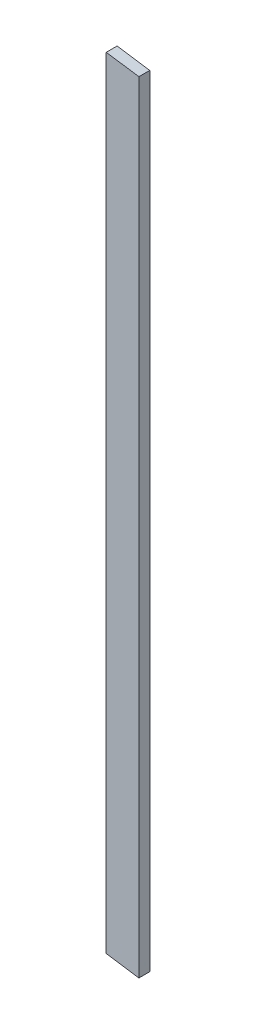
ISO-10303-21;
HEADER;
FILE_DESCRIPTION(('STEP AP214'),'2;1');
FILE_NAME('part.step','',(''),(''),'','','');
FILE_SCHEMA(('AUTOMOTIVE_DESIGN { 1 0 10303 214 1 1 1 1 }'));
ENDSEC;
DATA;
#1=APPLICATION_CONTEXT('core data for automotive mechanical design processes');
#2=APPLICATION_PROTOCOL_DEFINITION('international standard','automotive_design',2000,#1);
#3=PRODUCT_CONTEXT('',#1,'mechanical');
#4=PRODUCT('Part','Part','',(#3));
#5=PRODUCT_RELATED_PRODUCT_CATEGORY('part','',(#4));
#6=PRODUCT_DEFINITION_FORMATION('','',#4);
#7=PRODUCT_DEFINITION_CONTEXT('part definition',#1,'design');
#8=PRODUCT_DEFINITION('design','',#6,#7);
#9=PRODUCT_DEFINITION_SHAPE('','',#8);
#10=(LENGTH_UNIT() NAMED_UNIT(*) SI_UNIT(.MILLI.,.METRE.));
#11=(NAMED_UNIT(*) PLANE_ANGLE_UNIT() SI_UNIT($,.RADIAN.));
#12=(NAMED_UNIT(*) SI_UNIT($,.STERADIAN.) SOLID_ANGLE_UNIT());
#13=UNCERTAINTY_MEASURE_WITH_UNIT(LENGTH_MEASURE(1.E-05),#10,'distance_accuracy_value','');
#14=(GEOMETRIC_REPRESENTATION_CONTEXT(3) GLOBAL_UNCERTAINTY_ASSIGNED_CONTEXT((#13)) GLOBAL_UNIT_ASSIGNED_CONTEXT((#10,
#11,#12)) REPRESENTATION_CONTEXT('',''));
#15=CARTESIAN_POINT('',(0.,0.,0.));
#16=DIRECTION('',(0.,0.,1.));
#17=DIRECTION('',(1.,0.,0.));
#18=AXIS2_PLACEMENT_3D('',#15,#16,#17);
#19=CARTESIAN_POINT('',(19.0499999999999,609.6,12.7));
#20=DIRECTION('',(-1.,0.,0.));
#21=DIRECTION('',(0.,-1.,0.));
#22=AXIS2_PLACEMENT_3D('',#19,#20,#21);
#23=PLANE('',#22);
#24=DIRECTION('',(0.,0.,1.));
#25=VECTOR('',#24,1.);
#26=CARTESIAN_POINT('',(19.0500000000001,301.933356,0.));
#27=LINE('',#26,#25);
#28=CARTESIAN_POINT('',(19.05,301.933356,0.));
#29=VERTEX_POINT('',#28);
#30=CARTESIAN_POINT('',(19.0500000000001,301.933356,12.7));
#31=VERTEX_POINT('',#30);
#32=EDGE_CURVE('E61',#29,#31,#27,.T.);
#33=ORIENTED_EDGE('',*,*,#32,.T.);
#34=DIRECTION('',(0.,1.,0.));
#35=VECTOR('',#34,1.);
#36=CARTESIAN_POINT('',(19.0499999999999,609.6,12.7));
#37=LINE('',#36,#35);
#38=CARTESIAN_POINT('',(19.0500000000001,-609.6,12.7));
#39=VERTEX_POINT('',#38);
#40=EDGE_CURVE('E88',#39,#31,#37,.T.);
#41=ORIENTED_EDGE('',*,*,#40,.F.);
#42=DIRECTION('',(0.,0.,-1.));
#43=VECTOR('',#42,1.);
#44=CARTESIAN_POINT('',(19.0500000000001,-609.6,12.7));
#45=LINE('',#44,#43);
#46=CARTESIAN_POINT('',(19.0500000000001,-609.6,0.));
#47=VERTEX_POINT('',#46);
#48=EDGE_CURVE('E47',#39,#47,#45,.T.);
#49=ORIENTED_EDGE('',*,*,#48,.T.);
#50=DIRECTION('',(0.,1.,0.));
#51=VECTOR('',#50,1.);
#52=CARTESIAN_POINT('',(19.0499999999999,609.6,0.));
#53=LINE('',#52,#51);
#54=EDGE_CURVE('E86',#47,#29,#53,.T.);
#55=ORIENTED_EDGE('',*,*,#54,.T.);
#56=EDGE_LOOP('',(#33,#41,#49,#55));
#57=FACE_BOUND('',#56,.T.);
#58=ADVANCED_FACE('F39',(#57),#23,.F.);
#59=CARTESIAN_POINT('',(-19.0500000000001,609.6,12.7));
#60=DIRECTION('',(1.,0.,0.));
#61=DIRECTION('',(0.,1.,0.));
#62=AXIS2_PLACEMENT_3D('',#59,#60,#61);
#63=PLANE('',#62);
#64=DIRECTION('',(0.,0.,-1.));
#65=VECTOR('',#64,1.);
#66=CARTESIAN_POINT('',(-19.0499999999999,-603.967086605282,12.7));
#67=LINE('',#66,#65);
#68=CARTESIAN_POINT('',(-19.0500000000001,-603.967086605282,12.7));
#69=VERTEX_POINT('',#68);
#70=CARTESIAN_POINT('',(-19.0499999999999,-603.967086605282,0.));
#71=VERTEX_POINT('',#70);
#72=EDGE_CURVE('E53',#69,#71,#67,.T.);
#73=ORIENTED_EDGE('',*,*,#72,.F.);
#74=DIRECTION('',(0.,-1.,0.));
#75=VECTOR('',#74,1.);
#76=CARTESIAN_POINT('',(-19.0500000000001,609.6,12.7));
#77=LINE('',#76,#75);
#78=CARTESIAN_POINT('',(-19.0500000000001,307.566269394718,12.7));
#79=VERTEX_POINT('',#78);
#80=EDGE_CURVE('E90',#79,#69,#77,.T.);
#81=ORIENTED_EDGE('',*,*,#80,.F.);
#82=DIRECTION('',(0.,0.,1.));
#83=VECTOR('',#82,1.);
#84=CARTESIAN_POINT('',(-19.05,307.566269394718,12.7));
#85=LINE('',#84,#83);
#86=CARTESIAN_POINT('',(-19.0500000000001,307.566269394718,0.));
#87=VERTEX_POINT('',#86);
#88=EDGE_CURVE('E99',#87,#79,#85,.T.);
#89=ORIENTED_EDGE('',*,*,#88,.F.);
#90=DIRECTION('',(0.,-1.,0.));
#91=VECTOR('',#90,1.);
#92=CARTESIAN_POINT('',(-19.0500000000001,609.6,0.));
#93=LINE('',#92,#91);
#94=EDGE_CURVE('E94',#87,#71,#93,.T.);
#95=ORIENTED_EDGE('',*,*,#94,.T.);
#96=EDGE_LOOP('',(#73,#81,#89,#95));
#97=FACE_BOUND('',#96,.T.);
#98=ADVANCED_FACE('F123',(#97),#63,.F.);
#99=CARTESIAN_POINT('',(0.,0.,12.7));
#100=DIRECTION('',(0.,0.,1.));
#101=DIRECTION('',(1.,0.,0.));
#102=AXIS2_PLACEMENT_3D('',#99,#100,#101);
#103=PLANE('',#102);
#104=ORIENTED_EDGE('',*,*,#80,.T.);
#105=DIRECTION('',(0.989246821597342,-0.146255686930651,0.));
#106=VECTOR('',#105,1.);
#107=CARTESIAN_POINT('',(-417.041065013319,-545.125900224926,12.7));
#108=LINE('',#107,#106);
#109=EDGE_CURVE('E115',#69,#39,#108,.T.);
#110=ORIENTED_EDGE('',*,*,#109,.T.);
#111=ORIENTED_EDGE('',*,*,#40,.T.);
#112=DIRECTION('',(-0.989246821597342,0.146255686930651,0.));
#113=VECTOR('',#112,1.);
#114=CARTESIAN_POINT('',(19.0500000000001,301.933356,12.7));
#115=LINE('',#114,#113);
#116=EDGE_CURVE('E111',#31,#79,#115,.T.);
#117=ORIENTED_EDGE('',*,*,#116,.T.);
#118=EDGE_LOOP('',(#104,#110,#111,#117));
#119=FACE_BOUND('',#118,.T.);
#120=ADVANCED_FACE('F125',(#119),#103,.T.);
#121=CARTESIAN_POINT('',(0.,0.,0.));
#122=DIRECTION('',(0.,0.,1.));
#123=DIRECTION('',(1.,0.,0.));
#124=AXIS2_PLACEMENT_3D('',#121,#122,#123);
#125=PLANE('',#124);
#126=DIRECTION('',(0.989246821597342,-0.146255686930651,0.));
#127=VECTOR('',#126,1.);
#128=CARTESIAN_POINT('',(-87.7912472774721,-593.804002811086,0.));
#129=LINE('',#128,#127);
#130=EDGE_CURVE('E12',#71,#47,#129,.T.);
#131=ORIENTED_EDGE('',*,*,#130,.F.);
#132=ORIENTED_EDGE('',*,*,#94,.F.);
#133=DIRECTION('',(-0.989246821597342,0.146255686930651,0.));
#134=VECTOR('',#133,1.);
#135=CARTESIAN_POINT('',(19.0500000000001,301.933356,0.));
#136=LINE('',#135,#134);
#137=EDGE_CURVE('E92',#29,#87,#136,.T.);
#138=ORIENTED_EDGE('',*,*,#137,.F.);
#139=ORIENTED_EDGE('',*,*,#54,.F.);
#140=EDGE_LOOP('',(#131,#132,#138,#139));
#141=FACE_BOUND('',#140,.T.);
#142=ADVANCED_FACE('F91',(#141),#125,.F.);
#143=CARTESIAN_POINT('',(19.0500000000001,301.933356,0.));
#144=DIRECTION('',(0.146255686930651,0.989246821597342,0.));
#145=DIRECTION('',(-0.989246821597342,0.146255686930651,0.));
#146=AXIS2_PLACEMENT_3D('',#143,#144,#145);
#147=PLANE('',#146);
#148=ORIENTED_EDGE('',*,*,#88,.T.);
#149=ORIENTED_EDGE('',*,*,#116,.F.);
#150=ORIENTED_EDGE('',*,*,#32,.F.);
#151=ORIENTED_EDGE('',*,*,#137,.T.);
#152=EDGE_LOOP('',(#148,#149,#150,#151));
#153=FACE_BOUND('',#152,.T.);
#154=ADVANCED_FACE('F120',(#153),#147,.T.);
#155=CARTESIAN_POINT('',(-417.041065013319,-545.125900224926,0.));
#156=DIRECTION('',(-0.146255686930651,-0.989246821597342,0.));
#157=DIRECTION('',(0.989246821597342,-0.146255686930651,0.));
#158=AXIS2_PLACEMENT_3D('',#155,#156,#157);
#159=PLANE('',#158);
#160=ORIENTED_EDGE('',*,*,#72,.T.);
#161=ORIENTED_EDGE('',*,*,#130,.T.);
#162=ORIENTED_EDGE('',*,*,#48,.F.);
#163=ORIENTED_EDGE('',*,*,#109,.F.);
#164=EDGE_LOOP('',(#160,#161,#162,#163));
#165=FACE_BOUND('',#164,.T.);
#166=ADVANCED_FACE('F77',(#165),#159,.T.);
#167=CLOSED_SHELL('',(#58,#98,#120,#142,#154,#166));
#168=MANIFOLD_SOLID_BREP('B2',#167);
#169=ADVANCED_BREP_SHAPE_REPRESENTATION('',(#18,#168),#14);
#170=SHAPE_DEFINITION_REPRESENTATION(#9,#169);
ENDSEC;
END-ISO-10303-21;
